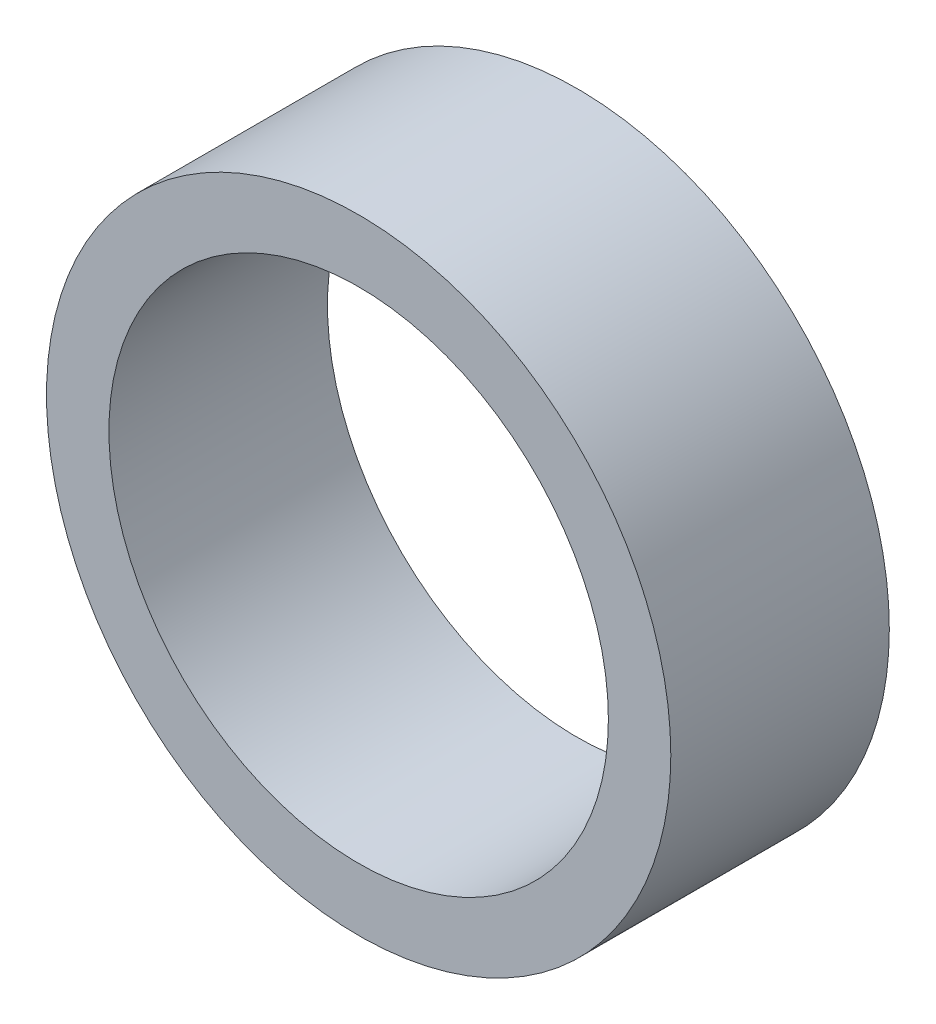
ISO-10303-21;
HEADER;
FILE_DESCRIPTION(('STEP AP214'),'2;1');
FILE_NAME('part.step','',(''),(''),'','','');
FILE_SCHEMA(('AUTOMOTIVE_DESIGN { 1 0 10303 214 1 1 1 1 }'));
ENDSEC;
DATA;
#1=APPLICATION_CONTEXT('core data for automotive mechanical design processes');
#2=APPLICATION_PROTOCOL_DEFINITION('international standard','automotive_design',2000,#1);
#3=PRODUCT_CONTEXT('',#1,'mechanical');
#4=PRODUCT('Part','Part','',(#3));
#5=PRODUCT_RELATED_PRODUCT_CATEGORY('part','',(#4));
#6=PRODUCT_DEFINITION_FORMATION('','',#4);
#7=PRODUCT_DEFINITION_CONTEXT('part definition',#1,'design');
#8=PRODUCT_DEFINITION('design','',#6,#7);
#9=PRODUCT_DEFINITION_SHAPE('','',#8);
#10=(LENGTH_UNIT() NAMED_UNIT(*) SI_UNIT(.MILLI.,.METRE.));
#11=(NAMED_UNIT(*) PLANE_ANGLE_UNIT() SI_UNIT($,.RADIAN.));
#12=(NAMED_UNIT(*) SI_UNIT($,.STERADIAN.) SOLID_ANGLE_UNIT());
#13=UNCERTAINTY_MEASURE_WITH_UNIT(LENGTH_MEASURE(1.E-05),#10,'distance_accuracy_value','');
#14=(GEOMETRIC_REPRESENTATION_CONTEXT(3) GLOBAL_UNCERTAINTY_ASSIGNED_CONTEXT((#13)) GLOBAL_UNIT_ASSIGNED_CONTEXT((#10,
#11,#12)) REPRESENTATION_CONTEXT('',''));
#15=CARTESIAN_POINT('',(0.,0.,0.));
#16=DIRECTION('',(0.,0.,1.));
#17=DIRECTION('',(1.,0.,0.));
#18=AXIS2_PLACEMENT_3D('',#15,#16,#17);
#19=CARTESIAN_POINT('',(0.,0.,3.5));
#20=DIRECTION('',(0.,0.,1.));
#21=DIRECTION('',(1.,0.,0.));
#22=AXIS2_PLACEMENT_3D('',#19,#20,#21);
#23=PLANE('',#22);
#24=CARTESIAN_POINT('',(0.,0.,3.5));
#25=DIRECTION('',(0.,0.,1.));
#26=DIRECTION('',(1.,0.,0.));
#27=AXIS2_PLACEMENT_3D('',#24,#25,#26);
#28=CIRCLE('',#27,5.);
#29=CARTESIAN_POINT('',(5.,0.,3.5));
#30=VERTEX_POINT('',#29);
#31=EDGE_CURVE('E10',#30,#30,#28,.T.);
#32=ORIENTED_EDGE('',*,*,#31,.T.);
#33=EDGE_LOOP('',(#32));
#34=FACE_BOUND('',#33,.T.);
#35=CARTESIAN_POINT('',(0.,0.,3.5));
#36=DIRECTION('',(0.,0.,1.));
#37=DIRECTION('',(1.,0.,0.));
#38=AXIS2_PLACEMENT_3D('',#35,#36,#37);
#39=CIRCLE('',#38,4.);
#40=CARTESIAN_POINT('',(4.,0.,3.5));
#41=VERTEX_POINT('',#40);
#42=EDGE_CURVE('E43',#41,#41,#39,.T.);
#43=ORIENTED_EDGE('',*,*,#42,.F.);
#44=EDGE_LOOP('',(#43));
#45=FACE_BOUND('',#44,.T.);
#46=ADVANCED_FACE('F32',(#34,#45),#23,.T.);
#47=CARTESIAN_POINT('',(0.,0.,0.));
#48=DIRECTION('',(0.,0.,1.));
#49=DIRECTION('',(1.,0.,0.));
#50=AXIS2_PLACEMENT_3D('',#47,#48,#49);
#51=PLANE('',#50);
#52=CARTESIAN_POINT('',(0.,0.,0.));
#53=DIRECTION('',(0.,0.,1.));
#54=DIRECTION('',(1.,0.,0.));
#55=AXIS2_PLACEMENT_3D('',#52,#53,#54);
#56=CIRCLE('',#55,5.);
#57=CARTESIAN_POINT('',(5.,0.,0.));
#58=VERTEX_POINT('',#57);
#59=EDGE_CURVE('E36',#58,#58,#56,.T.);
#60=ORIENTED_EDGE('',*,*,#59,.F.);
#61=EDGE_LOOP('',(#60));
#62=FACE_BOUND('',#61,.T.);
#63=CARTESIAN_POINT('',(0.,0.,0.));
#64=DIRECTION('',(0.,0.,1.));
#65=DIRECTION('',(1.,0.,0.));
#66=AXIS2_PLACEMENT_3D('',#63,#64,#65);
#67=CIRCLE('',#66,4.);
#68=CARTESIAN_POINT('',(4.,0.,0.));
#69=VERTEX_POINT('',#68);
#70=EDGE_CURVE('E45',#69,#69,#67,.T.);
#71=ORIENTED_EDGE('',*,*,#70,.T.);
#72=EDGE_LOOP('',(#71));
#73=FACE_BOUND('',#72,.T.);
#74=ADVANCED_FACE('F55',(#62,#73),#51,.F.);
#75=CARTESIAN_POINT('',(0.,0.,3.5));
#76=DIRECTION('',(0.,0.,-1.));
#77=DIRECTION('',(-1.,0.,0.));
#78=AXIS2_PLACEMENT_3D('',#75,#76,#77);
#79=CYLINDRICAL_SURFACE('',#78,5.);
#80=ORIENTED_EDGE('',*,*,#31,.F.);
#81=EDGE_LOOP('',(#80));
#82=FACE_BOUND('',#81,.T.);
#83=ORIENTED_EDGE('',*,*,#59,.T.);
#84=EDGE_LOOP('',(#83));
#85=FACE_BOUND('',#84,.T.);
#86=ADVANCED_FACE('F34',(#82,#85),#79,.T.);
#87=CARTESIAN_POINT('',(0.,0.,3.5));
#88=DIRECTION('',(0.,0.,-1.));
#89=DIRECTION('',(-1.,0.,0.));
#90=AXIS2_PLACEMENT_3D('',#87,#88,#89);
#91=CYLINDRICAL_SURFACE('',#90,4.);
#92=ORIENTED_EDGE('',*,*,#42,.T.);
#93=EDGE_LOOP('',(#92));
#94=FACE_BOUND('',#93,.T.);
#95=ORIENTED_EDGE('',*,*,#70,.F.);
#96=EDGE_LOOP('',(#95));
#97=FACE_BOUND('',#96,.T.);
#98=ADVANCED_FACE('F51',(#94,#97),#91,.F.);
#99=CLOSED_SHELL('',(#46,#74,#86,#98));
#100=MANIFOLD_SOLID_BREP('B2',#99);
#101=ADVANCED_BREP_SHAPE_REPRESENTATION('',(#18,#100),#14);
#102=SHAPE_DEFINITION_REPRESENTATION(#9,#101);
ENDSEC;
END-ISO-10303-21;
